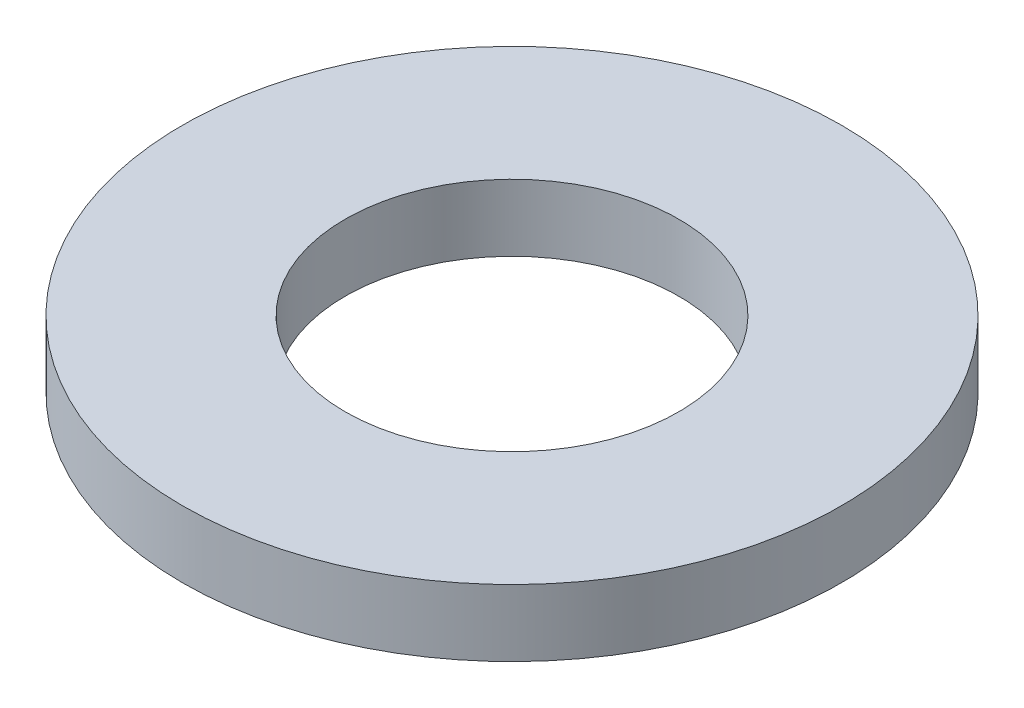
ISO-10303-21;
HEADER;
FILE_DESCRIPTION(('STEP AP214'),'2;1');
FILE_NAME('part.step','',(''),(''),'','','');
FILE_SCHEMA(('AUTOMOTIVE_DESIGN { 1 0 10303 214 1 1 1 1 }'));
ENDSEC;
DATA;
#1=APPLICATION_CONTEXT('core data for automotive mechanical design processes');
#2=APPLICATION_PROTOCOL_DEFINITION('international standard','automotive_design',2000,#1);
#3=PRODUCT_CONTEXT('',#1,'mechanical');
#4=PRODUCT('Part','Part','',(#3));
#5=PRODUCT_RELATED_PRODUCT_CATEGORY('part','',(#4));
#6=PRODUCT_DEFINITION_FORMATION('','',#4);
#7=PRODUCT_DEFINITION_CONTEXT('part definition',#1,'design');
#8=PRODUCT_DEFINITION('design','',#6,#7);
#9=PRODUCT_DEFINITION_SHAPE('','',#8);
#10=(LENGTH_UNIT() NAMED_UNIT(*) SI_UNIT(.MILLI.,.METRE.));
#11=(NAMED_UNIT(*) PLANE_ANGLE_UNIT() SI_UNIT($,.RADIAN.));
#12=(NAMED_UNIT(*) SI_UNIT($,.STERADIAN.) SOLID_ANGLE_UNIT());
#13=UNCERTAINTY_MEASURE_WITH_UNIT(LENGTH_MEASURE(1.E-05),#10,'distance_accuracy_value','');
#14=(GEOMETRIC_REPRESENTATION_CONTEXT(3) GLOBAL_UNCERTAINTY_ASSIGNED_CONTEXT((#13)) GLOBAL_UNIT_ASSIGNED_CONTEXT((#10,
#11,#12)) REPRESENTATION_CONTEXT('',''));
#15=CARTESIAN_POINT('',(0.,0.,0.));
#16=DIRECTION('',(0.,0.,1.));
#17=DIRECTION('',(1.,0.,0.));
#18=AXIS2_PLACEMENT_3D('',#15,#16,#17);
#19=CARTESIAN_POINT('',(0.,1.6,0.));
#20=DIRECTION('',(0.,1.,0.));
#21=DIRECTION('',(0.,0.,1.));
#22=AXIS2_PLACEMENT_3D('',#19,#20,#21);
#23=PLANE('',#22);
#24=CARTESIAN_POINT('',(0.,1.6,0.));
#25=DIRECTION('',(0.,1.,0.));
#26=DIRECTION('',(0.,0.,1.));
#27=AXIS2_PLACEMENT_3D('',#24,#25,#26);
#28=CIRCLE('',#27,4.);
#29=CARTESIAN_POINT('',(0.,1.6,4.));
#30=VERTEX_POINT('',#29);
#31=EDGE_CURVE('E27',#30,#30,#28,.F.);
#32=ORIENTED_EDGE('',*,*,#31,.T.);
#33=EDGE_LOOP('',(#32));
#34=FACE_BOUND('',#33,.T.);
#35=CARTESIAN_POINT('',(0.,1.6,0.));
#36=DIRECTION('',(0.,1.,0.));
#37=DIRECTION('',(0.,0.,1.));
#38=AXIS2_PLACEMENT_3D('',#35,#36,#37);
#39=CIRCLE('',#38,7.9);
#40=CARTESIAN_POINT('',(0.,1.6,7.9));
#41=VERTEX_POINT('',#40);
#42=EDGE_CURVE('E18',#41,#41,#39,.F.);
#43=ORIENTED_EDGE('',*,*,#42,.F.);
#44=EDGE_LOOP('',(#43));
#45=FACE_BOUND('',#44,.T.);
#46=ADVANCED_FACE('F15',(#34,#45),#23,.T.);
#47=CARTESIAN_POINT('',(0.,0.,0.));
#48=DIRECTION('',(0.,1.,0.));
#49=DIRECTION('',(0.,0.,1.));
#50=AXIS2_PLACEMENT_3D('',#47,#48,#49);
#51=CYLINDRICAL_SURFACE('',#50,7.9);
#52=ORIENTED_EDGE('',*,*,#42,.T.);
#53=EDGE_LOOP('',(#52));
#54=FACE_BOUND('',#53,.T.);
#55=CARTESIAN_POINT('',(0.,0.,0.));
#56=DIRECTION('',(0.,1.,0.));
#57=DIRECTION('',(0.,0.,1.));
#58=AXIS2_PLACEMENT_3D('',#55,#56,#57);
#59=CIRCLE('',#58,7.9);
#60=CARTESIAN_POINT('',(0.,0.,7.9));
#61=VERTEX_POINT('',#60);
#62=EDGE_CURVE('E22',#61,#61,#59,.T.);
#63=ORIENTED_EDGE('',*,*,#62,.T.);
#64=EDGE_LOOP('',(#63));
#65=FACE_BOUND('',#64,.T.);
#66=ADVANCED_FACE('F35',(#54,#65),#51,.T.);
#67=CARTESIAN_POINT('',(0.,1.6,0.));
#68=DIRECTION('',(0.,1.,0.));
#69=DIRECTION('',(0.,0.,1.));
#70=AXIS2_PLACEMENT_3D('',#67,#68,#69);
#71=CYLINDRICAL_SURFACE('',#70,4.);
#72=ORIENTED_EDGE('',*,*,#31,.F.);
#73=EDGE_LOOP('',(#72));
#74=FACE_BOUND('',#73,.T.);
#75=CARTESIAN_POINT('',(0.,0.,0.));
#76=DIRECTION('',(0.,1.,0.));
#77=DIRECTION('',(0.,0.,1.));
#78=AXIS2_PLACEMENT_3D('',#75,#76,#77);
#79=CIRCLE('',#78,4.);
#80=CARTESIAN_POINT('',(0.,0.,4.));
#81=VERTEX_POINT('',#80);
#82=EDGE_CURVE('E10',#81,#81,#79,.F.);
#83=ORIENTED_EDGE('',*,*,#82,.T.);
#84=EDGE_LOOP('',(#83));
#85=FACE_BOUND('',#84,.T.);
#86=ADVANCED_FACE('F43',(#74,#85),#71,.F.);
#87=CARTESIAN_POINT('',(0.,0.,0.));
#88=DIRECTION('',(0.,1.,0.));
#89=DIRECTION('',(0.,0.,1.));
#90=AXIS2_PLACEMENT_3D('',#87,#88,#89);
#91=PLANE('',#90);
#92=ORIENTED_EDGE('',*,*,#82,.F.);
#93=EDGE_LOOP('',(#92));
#94=FACE_BOUND('',#93,.T.);
#95=ORIENTED_EDGE('',*,*,#62,.F.);
#96=EDGE_LOOP('',(#95));
#97=FACE_BOUND('',#96,.T.);
#98=ADVANCED_FACE('F44',(#94,#97),#91,.F.);
#99=CLOSED_SHELL('',(#46,#66,#86,#98));
#100=MANIFOLD_SOLID_BREP('B1',#99);
#101=ADVANCED_BREP_SHAPE_REPRESENTATION('',(#18,#100),#14);
#102=SHAPE_DEFINITION_REPRESENTATION(#9,#101);
ENDSEC;
END-ISO-10303-21;
